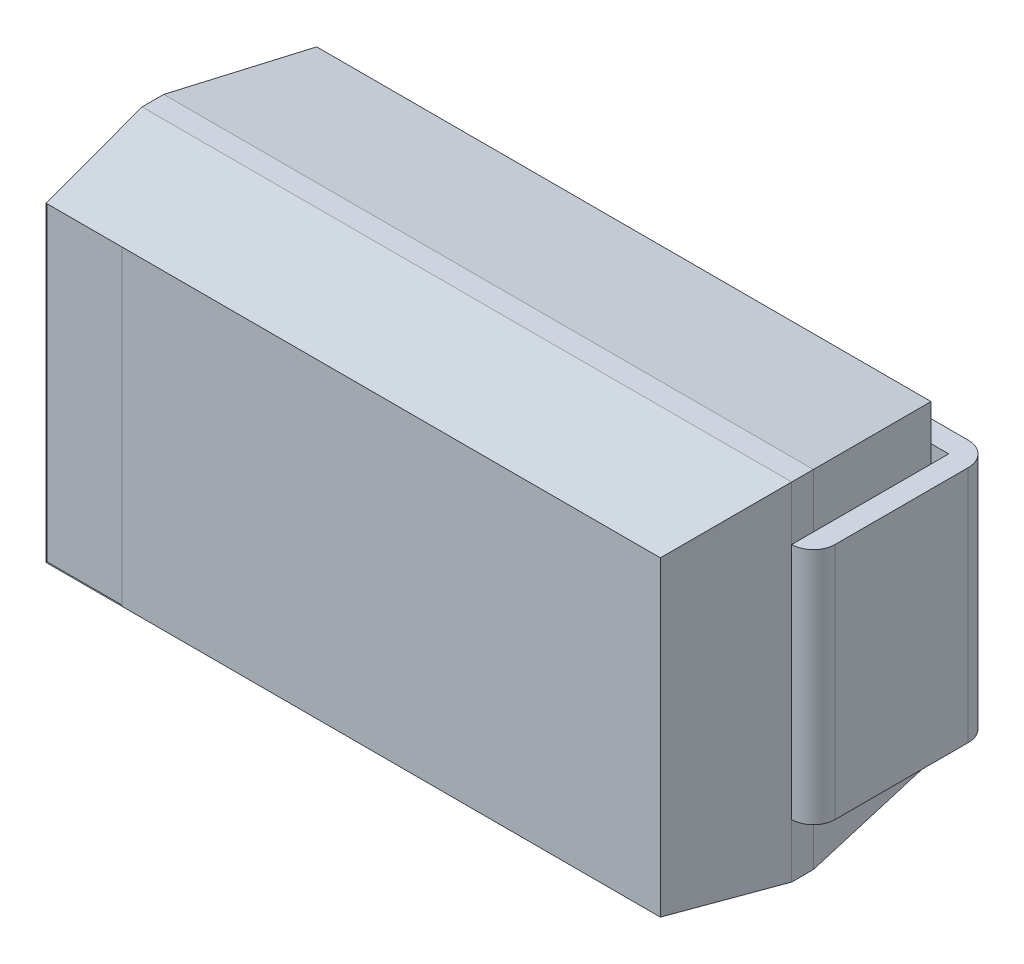
ISO-10303-21;
HEADER;
FILE_DESCRIPTION(('STEP AP214'),'2;1');
FILE_NAME('part.step','',(''),(''),'','','');
FILE_SCHEMA(('AUTOMOTIVE_DESIGN { 1 0 10303 214 1 1 1 1 }'));
ENDSEC;
DATA;
#1=APPLICATION_CONTEXT('core data for automotive mechanical design processes');
#2=APPLICATION_PROTOCOL_DEFINITION('international standard','automotive_design',2000,#1);
#3=PRODUCT_CONTEXT('',#1,'mechanical');
#4=PRODUCT('Part','Part','',(#3));
#5=PRODUCT_RELATED_PRODUCT_CATEGORY('part','',(#4));
#6=PRODUCT_DEFINITION_FORMATION('','',#4);
#7=PRODUCT_DEFINITION_CONTEXT('part definition',#1,'design');
#8=PRODUCT_DEFINITION('design','',#6,#7);
#9=PRODUCT_DEFINITION_SHAPE('','',#8);
#10=(LENGTH_UNIT() NAMED_UNIT(*) SI_UNIT(.MILLI.,.METRE.));
#11=(NAMED_UNIT(*) PLANE_ANGLE_UNIT() SI_UNIT($,.RADIAN.));
#12=(NAMED_UNIT(*) SI_UNIT($,.STERADIAN.) SOLID_ANGLE_UNIT());
#13=UNCERTAINTY_MEASURE_WITH_UNIT(LENGTH_MEASURE(1.E-05),#10,'distance_accuracy_value','');
#14=(GEOMETRIC_REPRESENTATION_CONTEXT(3) GLOBAL_UNCERTAINTY_ASSIGNED_CONTEXT((#13)) GLOBAL_UNIT_ASSIGNED_CONTEXT((#10,
#11,#12)) REPRESENTATION_CONTEXT('',''));
#15=CARTESIAN_POINT('',(0.,0.,0.));
#16=DIRECTION('',(0.,0.,1.));
#17=DIRECTION('',(1.,0.,0.));
#18=AXIS2_PLACEMENT_3D('',#15,#16,#17);
#19=CARTESIAN_POINT('',(1.9,-1.1,0.));
#20=DIRECTION('',(-1.,0.,0.));
#21=DIRECTION('',(0.,0.,-1.));
#22=AXIS2_PLACEMENT_3D('',#19,#20,#21);
#23=PLANE('',#22);
#24=DIRECTION('',(0.,1.,0.));
#25=VECTOR('',#24,1.);
#26=CARTESIAN_POINT('',(1.9,-1.1,0.));
#27=LINE('',#26,#25);
#28=CARTESIAN_POINT('',(1.9,-1.1,0.));
#29=VERTEX_POINT('',#28);
#30=CARTESIAN_POINT('',(1.9,1.1,0.));
#31=VERTEX_POINT('',#30);
#32=EDGE_CURVE('E53',#29,#31,#27,.T.);
#33=ORIENTED_EDGE('',*,*,#32,.F.);
#34=DIRECTION('',(0.,0.,-1.));
#35=VECTOR('',#34,1.);
#36=CARTESIAN_POINT('',(1.9,-1.1,0.));
#37=LINE('',#36,#35);
#38=CARTESIAN_POINT('',(1.9,-1.1,0.2));
#39=VERTEX_POINT('',#38);
#40=EDGE_CURVE('E166',#39,#29,#37,.T.);
#41=ORIENTED_EDGE('',*,*,#40,.F.);
#42=DIRECTION('',(0.,1.,0.));
#43=VECTOR('',#42,1.);
#44=CARTESIAN_POINT('',(1.9,-1.1,0.2));
#45=LINE('',#44,#43);
#46=CARTESIAN_POINT('',(1.9,1.1,0.2));
#47=VERTEX_POINT('',#46);
#48=EDGE_CURVE('E12',#39,#47,#45,.T.);
#49=ORIENTED_EDGE('',*,*,#48,.T.);
#50=DIRECTION('',(0.,0.,-1.));
#51=VECTOR('',#50,1.);
#52=CARTESIAN_POINT('',(1.9,1.1,0.));
#53=LINE('',#52,#51);
#54=EDGE_CURVE('E114',#47,#31,#53,.T.);
#55=ORIENTED_EDGE('',*,*,#54,.T.);
#56=EDGE_LOOP('',(#33,#41,#49,#55));
#57=FACE_BOUND('',#56,.T.);
#58=ADVANCED_FACE('F50',(#57),#23,.T.);
#59=CARTESIAN_POINT('',(1.9,-1.1,0.2));
#60=DIRECTION('',(0.,0.,1.));
#61=DIRECTION('',(-1.,0.,0.));
#62=AXIS2_PLACEMENT_3D('',#59,#60,#61);
#63=PLANE('',#62);
#64=ORIENTED_EDGE('',*,*,#48,.F.);
#65=DIRECTION('',(-1.,0.,0.));
#66=VECTOR('',#65,1.);
#67=CARTESIAN_POINT('',(1.9,-1.1,0.2));
#68=LINE('',#67,#66);
#69=CARTESIAN_POINT('',(3.,-1.1,0.2));
#70=VERTEX_POINT('',#69);
#71=EDGE_CURVE('E66',#70,#39,#68,.T.);
#72=ORIENTED_EDGE('',*,*,#71,.F.);
#73=DIRECTION('',(0.,1.,0.));
#74=VECTOR('',#73,1.);
#75=CARTESIAN_POINT('',(3.,-1.1,0.2));
#76=LINE('',#75,#74);
#77=CARTESIAN_POINT('',(3.,1.1,0.2));
#78=VERTEX_POINT('',#77);
#79=EDGE_CURVE('E58',#70,#78,#76,.T.);
#80=ORIENTED_EDGE('',*,*,#79,.T.);
#81=DIRECTION('',(-1.,0.,0.));
#82=VECTOR('',#81,1.);
#83=CARTESIAN_POINT('',(1.9,1.1,0.2));
#84=LINE('',#83,#82);
#85=EDGE_CURVE('E164',#78,#47,#84,.T.);
#86=ORIENTED_EDGE('',*,*,#85,.T.);
#87=EDGE_LOOP('',(#64,#72,#80,#86));
#88=FACE_BOUND('',#87,.T.);
#89=ADVANCED_FACE('F178',(#88),#63,.T.);
#90=CARTESIAN_POINT('',(3.,-1.1,0.2));
#91=DIRECTION('',(-1.,0.,0.));
#92=DIRECTION('',(0.,0.,-1.));
#93=AXIS2_PLACEMENT_3D('',#90,#91,#92);
#94=PLANE('',#93);
#95=ORIENTED_EDGE('',*,*,#79,.F.);
#96=DIRECTION('',(0.,0.,-1.));
#97=VECTOR('',#96,1.);
#98=CARTESIAN_POINT('',(3.,-1.1,1.45000000000003));
#99=LINE('',#98,#97);
#100=CARTESIAN_POINT('',(3.,-1.1,1.65000000000003));
#101=VERTEX_POINT('',#100);
#102=EDGE_CURVE('E71',#101,#70,#99,.T.);
#103=ORIENTED_EDGE('',*,*,#102,.F.);
#104=DIRECTION('',(0.,1.,0.));
#105=VECTOR('',#104,1.);
#106=CARTESIAN_POINT('',(3.,-1.1,1.65000000000003));
#107=LINE('',#106,#105);
#108=CARTESIAN_POINT('',(3.,1.1,1.65000000000003));
#109=VERTEX_POINT('',#108);
#110=EDGE_CURVE('E137',#101,#109,#107,.T.);
#111=ORIENTED_EDGE('',*,*,#110,.T.);
#112=DIRECTION('',(0.,0.,-1.));
#113=VECTOR('',#112,1.);
#114=CARTESIAN_POINT('',(3.,1.1,1.45000000000003));
#115=LINE('',#114,#113);
#116=EDGE_CURVE('E160',#109,#78,#115,.T.);
#117=ORIENTED_EDGE('',*,*,#116,.T.);
#118=EDGE_LOOP('',(#95,#103,#111,#117));
#119=FACE_BOUND('',#118,.T.);
#120=ADVANCED_FACE('F176',(#119),#94,.T.);
#121=CARTESIAN_POINT('',(3.,-1.1,1.45000000000003));
#122=DIRECTION('',(0.,1.,0.));
#123=DIRECTION('',(0.,0.,1.));
#124=AXIS2_PLACEMENT_3D('',#121,#122,#123);
#125=CYLINDRICAL_SURFACE('',#124,0.2);
#126=ORIENTED_EDGE('',*,*,#110,.F.);
#127=CARTESIAN_POINT('',(3.,-1.1,1.45000000000003));
#128=DIRECTION('',(0.,-1.,0.));
#129=DIRECTION('',(0.,0.,-1.));
#130=AXIS2_PLACEMENT_3D('',#127,#128,#129);
#131=CIRCLE('',#130,0.2);
#132=CARTESIAN_POINT('',(3.2,-1.1,1.45000000000003));
#133=VERTEX_POINT('',#132);
#134=EDGE_CURVE('E131',#133,#101,#131,.T.);
#135=ORIENTED_EDGE('',*,*,#134,.F.);
#136=DIRECTION('',(0.,1.,0.));
#137=VECTOR('',#136,1.);
#138=CARTESIAN_POINT('',(3.2,-1.1,1.45000000000003));
#139=LINE('',#138,#137);
#140=CARTESIAN_POINT('',(3.2,1.1,1.45000000000003));
#141=VERTEX_POINT('',#140);
#142=EDGE_CURVE('E140',#133,#141,#139,.T.);
#143=ORIENTED_EDGE('',*,*,#142,.T.);
#144=CARTESIAN_POINT('',(3.,1.1,1.45000000000003));
#145=DIRECTION('',(0.,-1.,0.));
#146=DIRECTION('',(0.,0.,-1.));
#147=AXIS2_PLACEMENT_3D('',#144,#145,#146);
#148=CIRCLE('',#147,0.2);
#149=EDGE_CURVE('E158',#141,#109,#148,.T.);
#150=ORIENTED_EDGE('',*,*,#149,.T.);
#151=EDGE_LOOP('',(#126,#135,#143,#150));
#152=FACE_BOUND('',#151,.T.);
#153=ADVANCED_FACE('F174',(#152),#125,.T.);
#154=CARTESIAN_POINT('',(3.2,-1.1,1.45000000000003));
#155=DIRECTION('',(1.,0.,0.));
#156=DIRECTION('',(0.,0.,1.));
#157=AXIS2_PLACEMENT_3D('',#154,#155,#156);
#158=PLANE('',#157);
#159=ORIENTED_EDGE('',*,*,#142,.F.);
#160=DIRECTION('',(0.,0.,1.));
#161=VECTOR('',#160,1.);
#162=CARTESIAN_POINT('',(3.2,-1.1,1.45000000000003));
#163=LINE('',#162,#161);
#164=CARTESIAN_POINT('',(3.2,-1.1,0.22));
#165=VERTEX_POINT('',#164);
#166=EDGE_CURVE('E151',#165,#133,#163,.T.);
#167=ORIENTED_EDGE('',*,*,#166,.F.);
#168=DIRECTION('',(0.,1.,0.));
#169=VECTOR('',#168,1.);
#170=CARTESIAN_POINT('',(3.2,-1.1,0.22));
#171=LINE('',#170,#169);
#172=CARTESIAN_POINT('',(3.2,1.1,0.22));
#173=VERTEX_POINT('',#172);
#174=EDGE_CURVE('E129',#165,#173,#171,.T.);
#175=ORIENTED_EDGE('',*,*,#174,.T.);
#176=DIRECTION('',(0.,0.,1.));
#177=VECTOR('',#176,1.);
#178=CARTESIAN_POINT('',(3.2,1.1,1.45000000000003));
#179=LINE('',#178,#177);
#180=EDGE_CURVE('E149',#173,#141,#179,.T.);
#181=ORIENTED_EDGE('',*,*,#180,.T.);
#182=EDGE_LOOP('',(#159,#167,#175,#181));
#183=FACE_BOUND('',#182,.T.);
#184=ADVANCED_FACE('F148',(#183),#158,.T.);
#185=CARTESIAN_POINT('',(2.98,-1.1,0.22));
#186=DIRECTION('',(0.,1.,0.));
#187=DIRECTION('',(0.,0.,1.));
#188=AXIS2_PLACEMENT_3D('',#185,#186,#187);
#189=CYLINDRICAL_SURFACE('',#188,0.22);
#190=ORIENTED_EDGE('',*,*,#174,.F.);
#191=CARTESIAN_POINT('',(2.98,-1.1,0.22));
#192=DIRECTION('',(0.,-1.,0.));
#193=DIRECTION('',(0.,0.,1.));
#194=AXIS2_PLACEMENT_3D('',#191,#192,#193);
#195=CIRCLE('',#194,0.22);
#196=CARTESIAN_POINT('',(2.98,-1.1,0.));
#197=VERTEX_POINT('',#196);
#198=EDGE_CURVE('E155',#197,#165,#195,.T.);
#199=ORIENTED_EDGE('',*,*,#198,.F.);
#200=DIRECTION('',(0.,1.,0.));
#201=VECTOR('',#200,1.);
#202=CARTESIAN_POINT('',(2.98,-1.1,0.));
#203=LINE('',#202,#201);
#204=CARTESIAN_POINT('',(2.98,1.1,0.));
#205=VERTEX_POINT('',#204);
#206=EDGE_CURVE('E128',#197,#205,#203,.T.);
#207=ORIENTED_EDGE('',*,*,#206,.T.);
#208=CARTESIAN_POINT('',(2.98,1.1,0.22));
#209=DIRECTION('',(0.,-1.,0.));
#210=DIRECTION('',(0.,0.,1.));
#211=AXIS2_PLACEMENT_3D('',#208,#209,#210);
#212=CIRCLE('',#211,0.22);
#213=EDGE_CURVE('E116',#205,#173,#212,.T.);
#214=ORIENTED_EDGE('',*,*,#213,.T.);
#215=EDGE_LOOP('',(#190,#199,#207,#214));
#216=FACE_BOUND('',#215,.T.);
#217=ADVANCED_FACE('F154',(#216),#189,.T.);
#218=CARTESIAN_POINT('',(1.9,-1.1,0.));
#219=DIRECTION('',(0.,0.,-1.));
#220=DIRECTION('',(1.,0.,0.));
#221=AXIS2_PLACEMENT_3D('',#218,#219,#220);
#222=PLANE('',#221);
#223=ORIENTED_EDGE('',*,*,#206,.F.);
#224=DIRECTION('',(1.,0.,0.));
#225=VECTOR('',#224,1.);
#226=CARTESIAN_POINT('',(1.9,-1.1,0.));
#227=LINE('',#226,#225);
#228=EDGE_CURVE('E127',#29,#197,#227,.T.);
#229=ORIENTED_EDGE('',*,*,#228,.F.);
#230=ORIENTED_EDGE('',*,*,#32,.T.);
#231=DIRECTION('',(1.,0.,0.));
#232=VECTOR('',#231,1.);
#233=CARTESIAN_POINT('',(1.9,1.1,0.));
#234=LINE('',#233,#232);
#235=EDGE_CURVE('E110',#31,#205,#234,.T.);
#236=ORIENTED_EDGE('',*,*,#235,.T.);
#237=EDGE_LOOP('',(#223,#229,#230,#236));
#238=FACE_BOUND('',#237,.T.);
#239=ADVANCED_FACE('F126',(#238),#222,.T.);
#240=CARTESIAN_POINT('',(3.,-1.1,1.45000000000003));
#241=DIRECTION('',(0.,-1.,0.));
#242=DIRECTION('',(0.,0.,-1.));
#243=AXIS2_PLACEMENT_3D('',#240,#241,#242);
#244=PLANE('',#243);
#245=ORIENTED_EDGE('',*,*,#40,.T.);
#246=ORIENTED_EDGE('',*,*,#228,.T.);
#247=ORIENTED_EDGE('',*,*,#198,.T.);
#248=ORIENTED_EDGE('',*,*,#166,.T.);
#249=ORIENTED_EDGE('',*,*,#134,.T.);
#250=ORIENTED_EDGE('',*,*,#102,.T.);
#251=ORIENTED_EDGE('',*,*,#71,.T.);
#252=EDGE_LOOP('',(#245,#246,#247,#248,#249,#250,#251));
#253=FACE_BOUND('',#252,.T.);
#254=ADVANCED_FACE('F172',(#253),#244,.T.);
#255=CARTESIAN_POINT('',(3.,1.1,1.45000000000003));
#256=DIRECTION('',(0.,-1.,0.));
#257=DIRECTION('',(0.,0.,-1.));
#258=AXIS2_PLACEMENT_3D('',#255,#256,#257);
#259=PLANE('',#258);
#260=ORIENTED_EDGE('',*,*,#54,.F.);
#261=ORIENTED_EDGE('',*,*,#85,.F.);
#262=ORIENTED_EDGE('',*,*,#116,.F.);
#263=ORIENTED_EDGE('',*,*,#149,.F.);
#264=ORIENTED_EDGE('',*,*,#180,.F.);
#265=ORIENTED_EDGE('',*,*,#213,.F.);
#266=ORIENTED_EDGE('',*,*,#235,.F.);
#267=EDGE_LOOP('',(#260,#261,#262,#263,#264,#265,#266));
#268=FACE_BOUND('',#267,.T.);
#269=ADVANCED_FACE('F112',(#268),#259,.F.);
#270=CLOSED_SHELL('',(#58,#89,#120,#153,#184,#217,#239,#254,#269));
#271=MANIFOLD_SOLID_BREP('B2',#270);
#272=CARTESIAN_POINT('',(-1.9,-1.1,0.));
#273=DIRECTION('',(1.,0.,0.));
#274=DIRECTION('',(0.,0.,-1.));
#275=AXIS2_PLACEMENT_3D('',#272,#273,#274);
#276=PLANE('',#275);
#277=DIRECTION('',(0.,1.,0.));
#278=VECTOR('',#277,1.);
#279=CARTESIAN_POINT('',(-1.9,-1.1,0.));
#280=LINE('',#279,#278);
#281=CARTESIAN_POINT('',(-1.9,-1.1,0.));
#282=VERTEX_POINT('',#281);
#283=CARTESIAN_POINT('',(-1.9,1.1,0.));
#284=VERTEX_POINT('',#283);
#285=EDGE_CURVE('E285',#282,#284,#280,.T.);
#286=ORIENTED_EDGE('',*,*,#285,.T.);
#287=DIRECTION('',(0.,0.,-1.));
#288=VECTOR('',#287,1.);
#289=CARTESIAN_POINT('',(-1.9,1.1,0.));
#290=LINE('',#289,#288);
#291=CARTESIAN_POINT('',(-1.9,1.1,0.2));
#292=VERTEX_POINT('',#291);
#293=EDGE_CURVE('E340',#292,#284,#290,.T.);
#294=ORIENTED_EDGE('',*,*,#293,.F.);
#295=DIRECTION('',(0.,1.,0.));
#296=VECTOR('',#295,1.);
#297=CARTESIAN_POINT('',(-1.9,-1.1,0.2));
#298=LINE('',#297,#296);
#299=CARTESIAN_POINT('',(-1.9,-1.1,0.2));
#300=VERTEX_POINT('',#299);
#301=EDGE_CURVE('E48',#300,#292,#298,.T.);
#302=ORIENTED_EDGE('',*,*,#301,.F.);
#303=DIRECTION('',(0.,0.,-1.));
#304=VECTOR('',#303,1.);
#305=CARTESIAN_POINT('',(-1.9,-1.1,0.));
#306=LINE('',#305,#304);
#307=EDGE_CURVE('E341',#300,#282,#306,.T.);
#308=ORIENTED_EDGE('',*,*,#307,.T.);
#309=EDGE_LOOP('',(#286,#294,#302,#308));
#310=FACE_BOUND('',#309,.T.);
#311=ADVANCED_FACE('F282',(#310),#276,.T.);
#312=CARTESIAN_POINT('',(-1.9,-1.1,0.2));
#313=DIRECTION('',(0.,0.,1.));
#314=DIRECTION('',(1.,0.,0.));
#315=AXIS2_PLACEMENT_3D('',#312,#313,#314);
#316=PLANE('',#315);
#317=ORIENTED_EDGE('',*,*,#301,.T.);
#318=DIRECTION('',(1.,0.,0.));
#319=VECTOR('',#318,1.);
#320=CARTESIAN_POINT('',(-1.9,1.1,0.2));
#321=LINE('',#320,#319);
#322=CARTESIAN_POINT('',(-3.,1.1,0.2));
#323=VERTEX_POINT('',#322);
#324=EDGE_CURVE('E359',#323,#292,#321,.T.);
#325=ORIENTED_EDGE('',*,*,#324,.F.);
#326=DIRECTION('',(0.,1.,0.));
#327=VECTOR('',#326,1.);
#328=CARTESIAN_POINT('',(-3.,-1.1,0.2));
#329=LINE('',#328,#327);
#330=CARTESIAN_POINT('',(-3.,-1.1,0.2));
#331=VERTEX_POINT('',#330);
#332=EDGE_CURVE('E290',#331,#323,#329,.T.);
#333=ORIENTED_EDGE('',*,*,#332,.F.);
#334=DIRECTION('',(1.,0.,0.));
#335=VECTOR('',#334,1.);
#336=CARTESIAN_POINT('',(-1.9,-1.1,0.2));
#337=LINE('',#336,#335);
#338=EDGE_CURVE('E346',#331,#300,#337,.T.);
#339=ORIENTED_EDGE('',*,*,#338,.T.);
#340=EDGE_LOOP('',(#317,#325,#333,#339));
#341=FACE_BOUND('',#340,.T.);
#342=ADVANCED_FACE('F408',(#341),#316,.T.);
#343=CARTESIAN_POINT('',(-3.,-1.1,0.2));
#344=DIRECTION('',(1.,0.,0.));
#345=DIRECTION('',(0.,0.,-1.));
#346=AXIS2_PLACEMENT_3D('',#343,#344,#345);
#347=PLANE('',#346);
#348=ORIENTED_EDGE('',*,*,#332,.T.);
#349=DIRECTION('',(0.,0.,-1.));
#350=VECTOR('',#349,1.);
#351=CARTESIAN_POINT('',(-3.,1.1,1.45000000000003));
#352=LINE('',#351,#350);
#353=CARTESIAN_POINT('',(-3.,1.1,1.65000000000003));
#354=VERTEX_POINT('',#353);
#355=EDGE_CURVE('E369',#354,#323,#352,.T.);
#356=ORIENTED_EDGE('',*,*,#355,.F.);
#357=DIRECTION('',(0.,1.,0.));
#358=VECTOR('',#357,1.);
#359=CARTESIAN_POINT('',(-3.,-1.1,1.65000000000003));
#360=LINE('',#359,#358);
#361=CARTESIAN_POINT('',(-3.,-1.1,1.65000000000003));
#362=VERTEX_POINT('',#361);
#363=EDGE_CURVE('E388',#362,#354,#360,.T.);
#364=ORIENTED_EDGE('',*,*,#363,.F.);
#365=DIRECTION('',(0.,0.,-1.));
#366=VECTOR('',#365,1.);
#367=CARTESIAN_POINT('',(-3.,-1.1,1.45000000000003));
#368=LINE('',#367,#366);
#369=EDGE_CURVE('E304',#362,#331,#368,.T.);
#370=ORIENTED_EDGE('',*,*,#369,.T.);
#371=EDGE_LOOP('',(#348,#356,#364,#370));
#372=FACE_BOUND('',#371,.T.);
#373=ADVANCED_FACE('F410',(#372),#347,.T.);
#374=CARTESIAN_POINT('',(-3.,-1.1,1.45000000000003));
#375=DIRECTION('',(0.,1.,0.));
#376=DIRECTION('',(0.,0.,1.));
#377=AXIS2_PLACEMENT_3D('',#374,#375,#376);
#378=CYLINDRICAL_SURFACE('',#377,0.2);
#379=ORIENTED_EDGE('',*,*,#363,.T.);
#380=CARTESIAN_POINT('',(-3.,1.1,1.45000000000003));
#381=DIRECTION('',(0.,1.,0.));
#382=DIRECTION('',(0.,0.,-1.));
#383=AXIS2_PLACEMENT_3D('',#380,#381,#382);
#384=CIRCLE('',#383,0.2);
#385=CARTESIAN_POINT('',(-3.2,1.1,1.45000000000003));
#386=VERTEX_POINT('',#385);
#387=EDGE_CURVE('E366',#386,#354,#384,.T.);
#388=ORIENTED_EDGE('',*,*,#387,.F.);
#389=DIRECTION('',(0.,1.,0.));
#390=VECTOR('',#389,1.);
#391=CARTESIAN_POINT('',(-3.2,-1.1,1.45000000000003));
#392=LINE('',#391,#390);
#393=CARTESIAN_POINT('',(-3.2,-1.1,1.45000000000003));
#394=VERTEX_POINT('',#393);
#395=EDGE_CURVE('E390',#394,#386,#392,.T.);
#396=ORIENTED_EDGE('',*,*,#395,.F.);
#397=CARTESIAN_POINT('',(-3.,-1.1,1.45000000000003));
#398=DIRECTION('',(0.,1.,0.));
#399=DIRECTION('',(0.,0.,-1.));
#400=AXIS2_PLACEMENT_3D('',#397,#398,#399);
#401=CIRCLE('',#400,0.2);
#402=EDGE_CURVE('E381',#394,#362,#401,.T.);
#403=ORIENTED_EDGE('',*,*,#402,.T.);
#404=EDGE_LOOP('',(#379,#388,#396,#403));
#405=FACE_BOUND('',#404,.T.);
#406=ADVANCED_FACE('F403',(#405),#378,.T.);
#407=CARTESIAN_POINT('',(-3.2,-1.1,1.45000000000003));
#408=DIRECTION('',(-1.,0.,0.));
#409=DIRECTION('',(0.,0.,1.));
#410=AXIS2_PLACEMENT_3D('',#407,#408,#409);
#411=PLANE('',#410);
#412=ORIENTED_EDGE('',*,*,#395,.T.);
#413=DIRECTION('',(0.,0.,1.));
#414=VECTOR('',#413,1.);
#415=CARTESIAN_POINT('',(-3.2,1.1,1.45000000000003));
#416=LINE('',#415,#414);
#417=CARTESIAN_POINT('',(-3.2,1.1,0.22));
#418=VERTEX_POINT('',#417);
#419=EDGE_CURVE('E363',#418,#386,#416,.T.);
#420=ORIENTED_EDGE('',*,*,#419,.F.);
#421=DIRECTION('',(0.,1.,0.));
#422=VECTOR('',#421,1.);
#423=CARTESIAN_POINT('',(-3.2,-1.1,0.22));
#424=LINE('',#423,#422);
#425=CARTESIAN_POINT('',(-3.2,-1.1,0.22));
#426=VERTEX_POINT('',#425);
#427=EDGE_CURVE('E392',#426,#418,#424,.T.);
#428=ORIENTED_EDGE('',*,*,#427,.F.);
#429=DIRECTION('',(0.,0.,1.));
#430=VECTOR('',#429,1.);
#431=CARTESIAN_POINT('',(-3.2,-1.1,1.45000000000003));
#432=LINE('',#431,#430);
#433=EDGE_CURVE('E378',#426,#394,#432,.T.);
#434=ORIENTED_EDGE('',*,*,#433,.T.);
#435=EDGE_LOOP('',(#412,#420,#428,#434));
#436=FACE_BOUND('',#435,.T.);
#437=ADVANCED_FACE('F400',(#436),#411,.T.);
#438=CARTESIAN_POINT('',(-2.98,-1.1,0.22));
#439=DIRECTION('',(0.,1.,0.));
#440=DIRECTION('',(0.,0.,1.));
#441=AXIS2_PLACEMENT_3D('',#438,#439,#440);
#442=CYLINDRICAL_SURFACE('',#441,0.22);
#443=ORIENTED_EDGE('',*,*,#427,.T.);
#444=CARTESIAN_POINT('',(-2.98,1.1,0.22));
#445=DIRECTION('',(0.,1.,0.));
#446=DIRECTION('',(0.,0.,1.));
#447=AXIS2_PLACEMENT_3D('',#444,#445,#446);
#448=CIRCLE('',#447,0.22);
#449=CARTESIAN_POINT('',(-2.98,1.1,0.));
#450=VERTEX_POINT('',#449);
#451=EDGE_CURVE('E353',#450,#418,#448,.T.);
#452=ORIENTED_EDGE('',*,*,#451,.F.);
#453=DIRECTION('',(0.,1.,0.));
#454=VECTOR('',#453,1.);
#455=CARTESIAN_POINT('',(-2.98,-1.1,0.));
#456=LINE('',#455,#454);
#457=CARTESIAN_POINT('',(-2.98,-1.1,0.));
#458=VERTEX_POINT('',#457);
#459=EDGE_CURVE('E345',#458,#450,#456,.T.);
#460=ORIENTED_EDGE('',*,*,#459,.F.);
#461=CARTESIAN_POINT('',(-2.98,-1.1,0.22));
#462=DIRECTION('',(0.,1.,0.));
#463=DIRECTION('',(0.,0.,1.));
#464=AXIS2_PLACEMENT_3D('',#461,#462,#463);
#465=CIRCLE('',#464,0.22);
#466=EDGE_CURVE('E375',#458,#426,#465,.T.);
#467=ORIENTED_EDGE('',*,*,#466,.T.);
#468=EDGE_LOOP('',(#443,#452,#460,#467));
#469=FACE_BOUND('',#468,.T.);
#470=ADVANCED_FACE('F394',(#469),#442,.T.);
#471=CARTESIAN_POINT('',(-1.9,-1.1,0.));
#472=DIRECTION('',(0.,0.,-1.));
#473=DIRECTION('',(-1.,0.,0.));
#474=AXIS2_PLACEMENT_3D('',#471,#472,#473);
#475=PLANE('',#474);
#476=ORIENTED_EDGE('',*,*,#459,.T.);
#477=DIRECTION('',(-1.,0.,0.));
#478=VECTOR('',#477,1.);
#479=CARTESIAN_POINT('',(-1.9,1.1,0.));
#480=LINE('',#479,#478);
#481=EDGE_CURVE('E348',#284,#450,#480,.T.);
#482=ORIENTED_EDGE('',*,*,#481,.F.);
#483=ORIENTED_EDGE('',*,*,#285,.F.);
#484=DIRECTION('',(-1.,0.,0.));
#485=VECTOR('',#484,1.);
#486=CARTESIAN_POINT('',(-1.9,-1.1,0.));
#487=LINE('',#486,#485);
#488=EDGE_CURVE('E373',#282,#458,#487,.T.);
#489=ORIENTED_EDGE('',*,*,#488,.T.);
#490=EDGE_LOOP('',(#476,#482,#483,#489));
#491=FACE_BOUND('',#490,.T.);
#492=ADVANCED_FACE('F349',(#491),#475,.T.);
#493=CARTESIAN_POINT('',(-3.,-1.1,1.45000000000003));
#494=DIRECTION('',(0.,-1.,0.));
#495=DIRECTION('',(0.,0.,-1.));
#496=AXIS2_PLACEMENT_3D('',#493,#494,#495);
#497=PLANE('',#496);
#498=ORIENTED_EDGE('',*,*,#307,.F.);
#499=ORIENTED_EDGE('',*,*,#338,.F.);
#500=ORIENTED_EDGE('',*,*,#369,.F.);
#501=ORIENTED_EDGE('',*,*,#402,.F.);
#502=ORIENTED_EDGE('',*,*,#433,.F.);
#503=ORIENTED_EDGE('',*,*,#466,.F.);
#504=ORIENTED_EDGE('',*,*,#488,.F.);
#505=EDGE_LOOP('',(#498,#499,#500,#501,#502,#503,#504));
#506=FACE_BOUND('',#505,.T.);
#507=ADVANCED_FACE('F405',(#506),#497,.T.);
#508=CARTESIAN_POINT('',(-3.,1.1,1.45000000000003));
#509=DIRECTION('',(0.,-1.,0.));
#510=DIRECTION('',(0.,0.,-1.));
#511=AXIS2_PLACEMENT_3D('',#508,#509,#510);
#512=PLANE('',#511);
#513=ORIENTED_EDGE('',*,*,#293,.T.);
#514=ORIENTED_EDGE('',*,*,#481,.T.);
#515=ORIENTED_EDGE('',*,*,#451,.T.);
#516=ORIENTED_EDGE('',*,*,#419,.T.);
#517=ORIENTED_EDGE('',*,*,#387,.T.);
#518=ORIENTED_EDGE('',*,*,#355,.T.);
#519=ORIENTED_EDGE('',*,*,#324,.T.);
#520=EDGE_LOOP('',(#513,#514,#515,#516,#517,#518,#519));
#521=FACE_BOUND('',#520,.T.);
#522=ADVANCED_FACE('F356',(#521),#512,.F.);
#523=CLOSED_SHELL('',(#311,#342,#373,#406,#437,#470,#492,#507,#522));
#524=MANIFOLD_SOLID_BREP('B6',#523);
#525=CARTESIAN_POINT('',(3.,1.6,2.7));
#526=DIRECTION('',(-1.,0.,0.));
#527=DIRECTION('',(0.,0.,1.));
#528=AXIS2_PLACEMENT_3D('',#525,#526,#527);
#529=PLANE('',#528);
#530=DIRECTION('',(0.,0.,-1.));
#531=VECTOR('',#530,1.);
#532=CARTESIAN_POINT('',(3.,-1.6,2.7));
#533=LINE('',#532,#531);
#534=CARTESIAN_POINT('',(3.,-1.6,1.64999999999998));
#535=VERTEX_POINT('',#534);
#536=CARTESIAN_POINT('',(3.,-1.6,1.45000000000003));
#537=VERTEX_POINT('',#536);
#538=EDGE_CURVE('E610',#535,#537,#533,.T.);
#539=ORIENTED_EDGE('',*,*,#538,.T.);
#540=DIRECTION('',(0.,1.,0.));
#541=VECTOR('',#540,1.);
#542=CARTESIAN_POINT('',(3.,1.6,1.45000000000003));
#543=LINE('',#542,#541);
#544=CARTESIAN_POINT('',(3.,1.6,1.45000000000003));
#545=VERTEX_POINT('',#544);
#546=EDGE_CURVE('E639',#537,#545,#543,.T.);
#547=ORIENTED_EDGE('',*,*,#546,.T.);
#548=DIRECTION('',(0.,0.,-1.));
#549=VECTOR('',#548,1.);
#550=CARTESIAN_POINT('',(3.,1.6,2.7));
#551=LINE('',#550,#549);
#552=CARTESIAN_POINT('',(3.,1.6,1.64999999999998));
#553=VERTEX_POINT('',#552);
#554=EDGE_CURVE('E618',#553,#545,#551,.T.);
#555=ORIENTED_EDGE('',*,*,#554,.F.);
#556=DIRECTION('',(0.,-1.,0.));
#557=VECTOR('',#556,1.);
#558=CARTESIAN_POINT('',(3.,-1.6,1.64999999999998));
#559=LINE('',#558,#557);
#560=EDGE_CURVE('E633',#553,#535,#559,.T.);
#561=ORIENTED_EDGE('',*,*,#560,.T.);
#562=EDGE_LOOP('',(#539,#547,#555,#561));
#563=FACE_BOUND('',#562,.T.);
#564=ADVANCED_FACE('F487',(#563),#529,.F.);
#565=CARTESIAN_POINT('',(-3.,1.6,2.7));
#566=DIRECTION('',(0.,-1.,0.));
#567=DIRECTION('',(0.,0.,-1.));
#568=AXIS2_PLACEMENT_3D('',#565,#566,#567);
#569=PLANE('',#568);
#570=ORIENTED_EDGE('',*,*,#554,.T.);
#571=DIRECTION('',(-1.,0.,0.));
#572=VECTOR('',#571,1.);
#573=CARTESIAN_POINT('',(-3.,1.6,1.45000000000003));
#574=LINE('',#573,#572);
#575=CARTESIAN_POINT('',(-3.,1.6,1.45000000000003));
#576=VERTEX_POINT('',#575);
#577=EDGE_CURVE('E661',#545,#576,#574,.T.);
#578=ORIENTED_EDGE('',*,*,#577,.T.);
#579=DIRECTION('',(0.,0.,-1.));
#580=VECTOR('',#579,1.);
#581=CARTESIAN_POINT('',(-3.,1.6,2.7));
#582=LINE('',#581,#580);
#583=CARTESIAN_POINT('',(-3.,1.6,1.64999999999998));
#584=VERTEX_POINT('',#583);
#585=EDGE_CURVE('E616',#584,#576,#582,.T.);
#586=ORIENTED_EDGE('',*,*,#585,.F.);
#587=DIRECTION('',(1.,0.,0.));
#588=VECTOR('',#587,1.);
#589=CARTESIAN_POINT('',(3.,1.6,1.64999999999998));
#590=LINE('',#589,#588);
#591=EDGE_CURVE('E630',#584,#553,#590,.T.);
#592=ORIENTED_EDGE('',*,*,#591,.T.);
#593=EDGE_LOOP('',(#570,#578,#586,#592));
#594=FACE_BOUND('',#593,.T.);
#595=ADVANCED_FACE('F694',(#594),#569,.F.);
#596=CARTESIAN_POINT('',(-3.,1.6,2.7));
#597=DIRECTION('',(1.,0.,0.));
#598=DIRECTION('',(0.,0.,-1.));
#599=AXIS2_PLACEMENT_3D('',#596,#597,#598);
#600=PLANE('',#599);
#601=ORIENTED_EDGE('',*,*,#585,.T.);
#602=DIRECTION('',(0.,-1.,0.));
#603=VECTOR('',#602,1.);
#604=CARTESIAN_POINT('',(-3.,1.6,1.45000000000003));
#605=LINE('',#604,#603);
#606=CARTESIAN_POINT('',(-3.,-1.6,1.45000000000003));
#607=VERTEX_POINT('',#606);
#608=EDGE_CURVE('E280',#576,#607,#605,.T.);
#609=ORIENTED_EDGE('',*,*,#608,.T.);
#610=DIRECTION('',(0.,0.,-1.));
#611=VECTOR('',#610,1.);
#612=CARTESIAN_POINT('',(-3.,-1.6,2.7));
#613=LINE('',#612,#611);
#614=CARTESIAN_POINT('',(-3.,-1.6,1.64999999999998));
#615=VERTEX_POINT('',#614);
#616=EDGE_CURVE('E613',#615,#607,#613,.T.);
#617=ORIENTED_EDGE('',*,*,#616,.F.);
#618=DIRECTION('',(0.,1.,0.));
#619=VECTOR('',#618,1.);
#620=CARTESIAN_POINT('',(-3.,1.6,1.64999999999998));
#621=LINE('',#620,#619);
#622=EDGE_CURVE('E637',#615,#584,#621,.T.);
#623=ORIENTED_EDGE('',*,*,#622,.T.);
#624=EDGE_LOOP('',(#601,#609,#617,#623));
#625=FACE_BOUND('',#624,.T.);
#626=ADVANCED_FACE('F731',(#625),#600,.F.);
#627=CARTESIAN_POINT('',(-3.,-1.6,2.7));
#628=DIRECTION('',(0.,1.,0.));
#629=DIRECTION('',(0.,0.,1.));
#630=AXIS2_PLACEMENT_3D('',#627,#628,#629);
#631=PLANE('',#630);
#632=ORIENTED_EDGE('',*,*,#616,.T.);
#633=DIRECTION('',(1.,0.,0.));
#634=VECTOR('',#633,1.);
#635=CARTESIAN_POINT('',(-3.,-1.6,1.45000000000003));
#636=LINE('',#635,#634);
#637=EDGE_CURVE('E496',#607,#537,#636,.T.);
#638=ORIENTED_EDGE('',*,*,#637,.T.);
#639=ORIENTED_EDGE('',*,*,#538,.F.);
#640=DIRECTION('',(-1.,0.,0.));
#641=VECTOR('',#640,1.);
#642=CARTESIAN_POINT('',(-3.,-1.6,1.64999999999998));
#643=LINE('',#642,#641);
#644=EDGE_CURVE('E635',#535,#615,#643,.T.);
#645=ORIENTED_EDGE('',*,*,#644,.T.);
#646=EDGE_LOOP('',(#632,#638,#639,#645));
#647=FACE_BOUND('',#646,.T.);
#648=ADVANCED_FACE('F784',(#647),#631,.F.);
#649=CARTESIAN_POINT('',(0.,0.,2.7));
#650=DIRECTION('',(0.,0.,1.));
#651=DIRECTION('',(1.,0.,0.));
#652=AXIS2_PLACEMENT_3D('',#649,#650,#651);
#653=PLANE('',#652);
#654=DIRECTION('',(0.,1.,0.));
#655=VECTOR('',#654,1.);
#656=CARTESIAN_POINT('',(-2.137,-1.437,2.7));
#657=LINE('',#656,#655);
#658=CARTESIAN_POINT('',(-2.137,-1.437,2.7));
#659=VERTEX_POINT('',#658);
#660=CARTESIAN_POINT('',(-2.137,1.437,2.7));
#661=VERTEX_POINT('',#660);
#662=EDGE_CURVE('E504',#659,#661,#657,.T.);
#663=ORIENTED_EDGE('',*,*,#662,.F.);
#664=DIRECTION('',(1.,0.,0.));
#665=VECTOR('',#664,1.);
#666=CARTESIAN_POINT('',(3.,-1.437,2.7));
#667=LINE('',#666,#665);
#668=CARTESIAN_POINT('',(2.837,-1.437,2.7));
#669=VERTEX_POINT('',#668);
#670=EDGE_CURVE('E622',#659,#669,#667,.T.);
#671=ORIENTED_EDGE('',*,*,#670,.T.);
#672=DIRECTION('',(0.,1.,0.));
#673=VECTOR('',#672,1.);
#674=CARTESIAN_POINT('',(2.837,1.6,2.7));
#675=LINE('',#674,#673);
#676=CARTESIAN_POINT('',(2.837,1.437,2.7));
#677=VERTEX_POINT('',#676);
#678=EDGE_CURVE('E625',#669,#677,#675,.T.);
#679=ORIENTED_EDGE('',*,*,#678,.T.);
#680=DIRECTION('',(-1.,0.,0.));
#681=VECTOR('',#680,1.);
#682=CARTESIAN_POINT('',(-3.,1.437,2.7));
#683=LINE('',#682,#681);
#684=EDGE_CURVE('E627',#677,#661,#683,.T.);
#685=ORIENTED_EDGE('',*,*,#684,.T.);
#686=EDGE_LOOP('',(#663,#671,#679,#685));
#687=FACE_BOUND('',#686,.T.);
#688=ADVANCED_FACE('F713',(#687),#653,.T.);
#689=CARTESIAN_POINT('',(0.,0.,0.2));
#690=DIRECTION('',(0.,0.,1.));
#691=DIRECTION('',(1.,0.,0.));
#692=AXIS2_PLACEMENT_3D('',#689,#690,#691);
#693=PLANE('',#692);
#694=DIRECTION('',(1.,0.,0.));
#695=VECTOR('',#694,1.);
#696=CARTESIAN_POINT('',(0.,1.437,0.2));
#697=LINE('',#696,#695);
#698=CARTESIAN_POINT('',(-2.837,1.437,0.2));
#699=VERTEX_POINT('',#698);
#700=CARTESIAN_POINT('',(2.837,1.437,0.2));
#701=VERTEX_POINT('',#700);
#702=EDGE_CURVE('E656',#699,#701,#697,.T.);
#703=ORIENTED_EDGE('',*,*,#702,.T.);
#704=DIRECTION('',(0.,-1.,0.));
#705=VECTOR('',#704,1.);
#706=CARTESIAN_POINT('',(2.837,0.,0.2));
#707=LINE('',#706,#705);
#708=CARTESIAN_POINT('',(2.837,-1.437,0.2));
#709=VERTEX_POINT('',#708);
#710=EDGE_CURVE('E658',#701,#709,#707,.T.);
#711=ORIENTED_EDGE('',*,*,#710,.T.);
#712=DIRECTION('',(-1.,0.,0.));
#713=VECTOR('',#712,1.);
#714=CARTESIAN_POINT('',(0.,-1.437,0.2));
#715=LINE('',#714,#713);
#716=CARTESIAN_POINT('',(-2.837,-1.437,0.2));
#717=VERTEX_POINT('',#716);
#718=EDGE_CURVE('E654',#709,#717,#715,.T.);
#719=ORIENTED_EDGE('',*,*,#718,.T.);
#720=DIRECTION('',(0.,1.,0.));
#721=VECTOR('',#720,1.);
#722=CARTESIAN_POINT('',(-2.837,0.,0.2));
#723=LINE('',#722,#721);
#724=EDGE_CURVE('E652',#717,#699,#723,.T.);
#725=ORIENTED_EDGE('',*,*,#724,.T.);
#726=EDGE_LOOP('',(#703,#711,#719,#725));
#727=FACE_BOUND('',#726,.T.);
#728=ADVANCED_FACE('F682',(#727),#693,.F.);
#729=CARTESIAN_POINT('',(0.,-1.437,2.7));
#730=DIRECTION('',(0.,-0.988164066809817,0.153400707514283));
#731=DIRECTION('',(-1.,0.,0.));
#732=AXIS2_PLACEMENT_3D('',#729,#730,#731);
#733=PLANE('',#732);
#734=DIRECTION('',(0.151627054128213,0.151627054128213,0.976738692236977));
#735=VECTOR('',#734,1.);
#736=CARTESIAN_POINT('',(-2.80396227278785,-1.40396227278785,2.91281971517032));
#737=LINE('',#736,#735);
#738=CARTESIAN_POINT('',(-2.837,-1.437,2.7));
#739=VERTEX_POINT('',#738);
#740=EDGE_CURVE('E645',#615,#739,#737,.T.);
#741=ORIENTED_EDGE('',*,*,#740,.F.);
#742=ORIENTED_EDGE('',*,*,#644,.F.);
#743=DIRECTION('',(-0.151627054128213,0.151627054128213,0.976738692236977));
#744=VECTOR('',#743,1.);
#745=CARTESIAN_POINT('',(2.77177520382681,-1.37177520382681,3.12015972995003));
#746=LINE('',#745,#744);
#747=EDGE_CURVE('E614',#669,#535,#746,.F.);
#748=ORIENTED_EDGE('',*,*,#747,.F.);
#749=ORIENTED_EDGE('',*,*,#670,.F.);
#750=EDGE_CURVE('E623',#739,#659,#667,.T.);
#751=ORIENTED_EDGE('',*,*,#750,.F.);
#752=EDGE_LOOP('',(#741,#742,#748,#749,#751));
#753=FACE_BOUND('',#752,.T.);
#754=ADVANCED_FACE('F709',(#753),#733,.T.);
#755=CARTESIAN_POINT('',(2.837,0.,2.7));
#756=DIRECTION('',(0.988164066809817,0.,0.153400707514283));
#757=DIRECTION('',(0.,-1.,0.));
#758=AXIS2_PLACEMENT_3D('',#755,#756,#757);
#759=PLANE('',#758);
#760=ORIENTED_EDGE('',*,*,#747,.T.);
#761=ORIENTED_EDGE('',*,*,#560,.F.);
#762=DIRECTION('',(-0.151627054128213,-0.151627054128213,0.976738692236977));
#763=VECTOR('',#762,1.);
#764=CARTESIAN_POINT('',(2.80396227278785,1.40396227278785,2.91281971517032));
#765=LINE('',#764,#763);
#766=EDGE_CURVE('E643',#677,#553,#765,.F.);
#767=ORIENTED_EDGE('',*,*,#766,.F.);
#768=ORIENTED_EDGE('',*,*,#678,.F.);
#769=EDGE_LOOP('',(#760,#761,#767,#768));
#770=FACE_BOUND('',#769,.T.);
#771=ADVANCED_FACE('F739',(#770),#759,.T.);
#772=CARTESIAN_POINT('',(-2.837,0.,2.7));
#773=DIRECTION('',(-0.988164066809817,0.,0.153400707514283));
#774=DIRECTION('',(0.,1.,0.));
#775=AXIS2_PLACEMENT_3D('',#772,#773,#774);
#776=PLANE('',#775);
#777=ORIENTED_EDGE('',*,*,#740,.T.);
#778=DIRECTION('',(0.,-1.,0.));
#779=VECTOR('',#778,1.);
#780=CARTESIAN_POINT('',(-2.837,-1.6,2.7));
#781=LINE('',#780,#779);
#782=CARTESIAN_POINT('',(-2.837,1.437,2.7));
#783=VERTEX_POINT('',#782);
#784=EDGE_CURVE('E579',#783,#739,#781,.T.);
#785=ORIENTED_EDGE('',*,*,#784,.F.);
#786=DIRECTION('',(-0.151627054128213,0.151627054128213,-0.976738692236977));
#787=VECTOR('',#786,1.);
#788=CARTESIAN_POINT('',(-2.80396227278785,1.40396227278785,2.91281971517032));
#789=LINE('',#788,#787);
#790=EDGE_CURVE('E640',#584,#783,#789,.F.);
#791=ORIENTED_EDGE('',*,*,#790,.F.);
#792=ORIENTED_EDGE('',*,*,#622,.F.);
#793=EDGE_LOOP('',(#777,#785,#791,#792));
#794=FACE_BOUND('',#793,.T.);
#795=ADVANCED_FACE('F705',(#794),#776,.T.);
#796=CARTESIAN_POINT('',(0.,1.437,2.7));
#797=DIRECTION('',(0.,0.988164066809817,0.153400707514283));
#798=DIRECTION('',(1.,0.,0.));
#799=AXIS2_PLACEMENT_3D('',#796,#797,#798);
#800=PLANE('',#799);
#801=ORIENTED_EDGE('',*,*,#766,.T.);
#802=ORIENTED_EDGE('',*,*,#591,.F.);
#803=ORIENTED_EDGE('',*,*,#790,.T.);
#804=DIRECTION('',(-1.,0.,0.));
#805=VECTOR('',#804,1.);
#806=CARTESIAN_POINT('',(-2.837,1.437,2.7));
#807=LINE('',#806,#805);
#808=EDGE_CURVE('E596',#661,#783,#807,.T.);
#809=ORIENTED_EDGE('',*,*,#808,.F.);
#810=ORIENTED_EDGE('',*,*,#684,.F.);
#811=EDGE_LOOP('',(#801,#802,#803,#809,#810));
#812=FACE_BOUND('',#811,.T.);
#813=ADVANCED_FACE('F698',(#812),#800,.T.);
#814=CARTESIAN_POINT('',(-3.,1.6,1.45000000000003));
#815=DIRECTION('',(0.991604834122273,0.,0.129305270369541));
#816=DIRECTION('',(0.,-1.,0.));
#817=AXIS2_PLACEMENT_3D('',#814,#815,#816);
#818=PLANE('',#817);
#819=DIRECTION('',(0.128237657070635,-0.128237657070635,-0.983417615572381));
#820=VECTOR('',#819,1.);
#821=CARTESIAN_POINT('',(-3.,1.6,1.45000000000003));
#822=LINE('',#821,#820);
#823=EDGE_CURVE('E666',#699,#576,#822,.F.);
#824=ORIENTED_EDGE('',*,*,#823,.F.);
#825=ORIENTED_EDGE('',*,*,#724,.F.);
#826=DIRECTION('',(-0.128237657070635,-0.128237657070635,0.983417615572381));
#827=VECTOR('',#826,1.);
#828=CARTESIAN_POINT('',(-2.94737633058891,-1.54737633058891,1.04644425298246));
#829=LINE('',#828,#827);
#830=EDGE_CURVE('E491',#607,#717,#829,.F.);
#831=ORIENTED_EDGE('',*,*,#830,.F.);
#832=ORIENTED_EDGE('',*,*,#608,.F.);
#833=EDGE_LOOP('',(#824,#825,#831,#832));
#834=FACE_BOUND('',#833,.T.);
#835=ADVANCED_FACE('F489',(#834),#818,.F.);
#836=CARTESIAN_POINT('',(-3.,-1.6,1.45000000000003));
#837=DIRECTION('',(0.,0.991604834122273,0.129305270369541));
#838=DIRECTION('',(1.,0.,0.));
#839=AXIS2_PLACEMENT_3D('',#836,#837,#838);
#840=PLANE('',#839);
#841=ORIENTED_EDGE('',*,*,#830,.T.);
#842=ORIENTED_EDGE('',*,*,#718,.F.);
#843=DIRECTION('',(0.128237657070635,-0.128237657070635,0.983417615572381));
#844=VECTOR('',#843,1.);
#845=CARTESIAN_POINT('',(2.90133061985421,-1.50133061985421,0.693332974342078));
#846=LINE('',#845,#844);
#847=EDGE_CURVE('E665',#537,#709,#846,.F.);
#848=ORIENTED_EDGE('',*,*,#847,.F.);
#849=ORIENTED_EDGE('',*,*,#637,.F.);
#850=EDGE_LOOP('',(#841,#842,#848,#849));
#851=FACE_BOUND('',#850,.T.);
#852=ADVANCED_FACE('F677',(#851),#840,.F.);
#853=CARTESIAN_POINT('',(-3.,1.6,1.45000000000003));
#854=DIRECTION('',(0.,-0.991604834122273,0.129305270369541));
#855=DIRECTION('',(-1.,0.,0.));
#856=AXIS2_PLACEMENT_3D('',#853,#854,#855);
#857=PLANE('',#856);
#858=ORIENTED_EDGE('',*,*,#823,.T.);
#859=ORIENTED_EDGE('',*,*,#577,.F.);
#860=DIRECTION('',(-0.128237657070635,-0.128237657070635,-0.983417615572381));
#861=VECTOR('',#860,1.);
#862=CARTESIAN_POINT('',(2.90133061985421,1.50133061985421,0.693332974342078));
#863=LINE('',#862,#861);
#864=EDGE_CURVE('E606',#701,#545,#863,.F.);
#865=ORIENTED_EDGE('',*,*,#864,.F.);
#866=ORIENTED_EDGE('',*,*,#702,.F.);
#867=EDGE_LOOP('',(#858,#859,#865,#866));
#868=FACE_BOUND('',#867,.T.);
#869=ADVANCED_FACE('F688',(#868),#857,.F.);
#870=CARTESIAN_POINT('',(3.,1.6,1.45000000000003));
#871=DIRECTION('',(-0.991604834122273,0.,0.129305270369541));
#872=DIRECTION('',(0.,1.,0.));
#873=AXIS2_PLACEMENT_3D('',#870,#871,#872);
#874=PLANE('',#873);
#875=ORIENTED_EDGE('',*,*,#847,.T.);
#876=ORIENTED_EDGE('',*,*,#710,.F.);
#877=ORIENTED_EDGE('',*,*,#864,.T.);
#878=ORIENTED_EDGE('',*,*,#546,.F.);
#879=EDGE_LOOP('',(#875,#876,#877,#878));
#880=FACE_BOUND('',#879,.T.);
#881=ADVANCED_FACE('F686',(#880),#874,.F.);
#882=CARTESIAN_POINT('',(-2.837,-1.437,2.69));
#883=DIRECTION('',(-1.,0.,0.));
#884=DIRECTION('',(0.,0.,1.));
#885=AXIS2_PLACEMENT_3D('',#882,#883,#884);
#886=PLANE('',#885);
#887=ORIENTED_EDGE('',*,*,#784,.T.);
#888=DIRECTION('',(0.,0.,1.));
#889=VECTOR('',#888,1.);
#890=CARTESIAN_POINT('',(-2.837,-1.437,2.69));
#891=LINE('',#890,#889);
#892=CARTESIAN_POINT('',(-2.837,-1.437,2.69));
#893=VERTEX_POINT('',#892);
#894=EDGE_CURVE('E572',#893,#739,#891,.T.);
#895=ORIENTED_EDGE('',*,*,#894,.F.);
#896=DIRECTION('',(0.,-1.,0.));
#897=VECTOR('',#896,1.);
#898=CARTESIAN_POINT('',(-2.837,-1.437,2.69));
#899=LINE('',#898,#897);
#900=CARTESIAN_POINT('',(-2.837,1.437,2.69));
#901=VERTEX_POINT('',#900);
#902=EDGE_CURVE('E576',#901,#893,#899,.T.);
#903=ORIENTED_EDGE('',*,*,#902,.F.);
#904=DIRECTION('',(0.,0.,1.));
#905=VECTOR('',#904,1.);
#906=CARTESIAN_POINT('',(-2.837,1.437,2.69));
#907=LINE('',#906,#905);
#908=EDGE_CURVE('E604',#901,#783,#907,.T.);
#909=ORIENTED_EDGE('',*,*,#908,.T.);
#910=EDGE_LOOP('',(#887,#895,#903,#909));
#911=FACE_BOUND('',#910,.T.);
#912=ADVANCED_FACE('F574',(#911),#886,.F.);
#913=CARTESIAN_POINT('',(-2.837,1.437,2.69));
#914=DIRECTION('',(0.,1.,0.));
#915=DIRECTION('',(0.,0.,1.));
#916=AXIS2_PLACEMENT_3D('',#913,#914,#915);
#917=PLANE('',#916);
#918=ORIENTED_EDGE('',*,*,#808,.T.);
#919=ORIENTED_EDGE('',*,*,#908,.F.);
#920=DIRECTION('',(-1.,0.,0.));
#921=VECTOR('',#920,1.);
#922=CARTESIAN_POINT('',(-2.837,1.437,2.69));
#923=LINE('',#922,#921);
#924=CARTESIAN_POINT('',(-2.137,1.437,2.69));
#925=VERTEX_POINT('',#924);
#926=EDGE_CURVE('E584',#925,#901,#923,.T.);
#927=ORIENTED_EDGE('',*,*,#926,.F.);
#928=DIRECTION('',(0.,0.,1.));
#929=VECTOR('',#928,1.);
#930=CARTESIAN_POINT('',(-2.137,1.437,2.69));
#931=LINE('',#930,#929);
#932=EDGE_CURVE('E607',#925,#661,#931,.T.);
#933=ORIENTED_EDGE('',*,*,#932,.T.);
#934=EDGE_LOOP('',(#918,#919,#927,#933));
#935=FACE_BOUND('',#934,.T.);
#936=ADVANCED_FACE('F716',(#935),#917,.F.);
#937=CARTESIAN_POINT('',(-2.137,-1.437,2.69));
#938=DIRECTION('',(1.,0.,0.));
#939=DIRECTION('',(0.,0.,-1.));
#940=AXIS2_PLACEMENT_3D('',#937,#938,#939);
#941=PLANE('',#940);
#942=ORIENTED_EDGE('',*,*,#662,.T.);
#943=ORIENTED_EDGE('',*,*,#932,.F.);
#944=DIRECTION('',(0.,1.,0.));
#945=VECTOR('',#944,1.);
#946=CARTESIAN_POINT('',(-2.137,-1.437,2.69));
#947=LINE('',#946,#945);
#948=CARTESIAN_POINT('',(-2.137,-1.437,2.69));
#949=VERTEX_POINT('',#948);
#950=EDGE_CURVE('E592',#949,#925,#947,.T.);
#951=ORIENTED_EDGE('',*,*,#950,.F.);
#952=DIRECTION('',(0.,0.,1.));
#953=VECTOR('',#952,1.);
#954=CARTESIAN_POINT('',(-2.137,-1.437,2.69));
#955=LINE('',#954,#953);
#956=EDGE_CURVE('E583',#949,#659,#955,.T.);
#957=ORIENTED_EDGE('',*,*,#956,.T.);
#958=EDGE_LOOP('',(#942,#943,#951,#957));
#959=FACE_BOUND('',#958,.T.);
#960=ADVANCED_FACE('F717',(#959),#941,.F.);
#961=CARTESIAN_POINT('',(-2.837,-1.437,2.69));
#962=DIRECTION('',(0.,-1.,0.));
#963=DIRECTION('',(0.,0.,-1.));
#964=AXIS2_PLACEMENT_3D('',#961,#962,#963);
#965=PLANE('',#964);
#966=ORIENTED_EDGE('',*,*,#750,.T.);
#967=ORIENTED_EDGE('',*,*,#956,.F.);
#968=DIRECTION('',(1.,0.,0.));
#969=VECTOR('',#968,1.);
#970=CARTESIAN_POINT('',(-2.837,-1.437,2.69));
#971=LINE('',#970,#969);
#972=EDGE_CURVE('E587',#893,#949,#971,.T.);
#973=ORIENTED_EDGE('',*,*,#972,.F.);
#974=ORIENTED_EDGE('',*,*,#894,.T.);
#975=EDGE_LOOP('',(#966,#967,#973,#974));
#976=FACE_BOUND('',#975,.T.);
#977=ADVANCED_FACE('F588',(#976),#965,.F.);
#978=CARTESIAN_POINT('',(0.,0.,2.69));
#979=DIRECTION('',(0.,0.,-1.));
#980=DIRECTION('',(-1.,0.,0.));
#981=AXIS2_PLACEMENT_3D('',#978,#979,#980);
#982=PLANE('',#981);
#983=ORIENTED_EDGE('',*,*,#902,.T.);
#984=ORIENTED_EDGE('',*,*,#972,.T.);
#985=ORIENTED_EDGE('',*,*,#950,.T.);
#986=ORIENTED_EDGE('',*,*,#926,.T.);
#987=EDGE_LOOP('',(#983,#984,#985,#986));
#988=FACE_BOUND('',#987,.T.);
#989=ADVANCED_FACE('F594',(#988),#982,.F.);
#990=CLOSED_SHELL('',(#564,#595,#626,#648,#688,#728,#754,#771,#795,#813,#835,#852,#869,#881,
#912,#936,#960,#977,#989));
#991=MANIFOLD_SOLID_BREP('B42',#990);
#992=ADVANCED_BREP_SHAPE_REPRESENTATION('',(#18,#271,#524,#991),#14);
#993=SHAPE_DEFINITION_REPRESENTATION(#9,#992);
ENDSEC;
END-ISO-10303-21;
